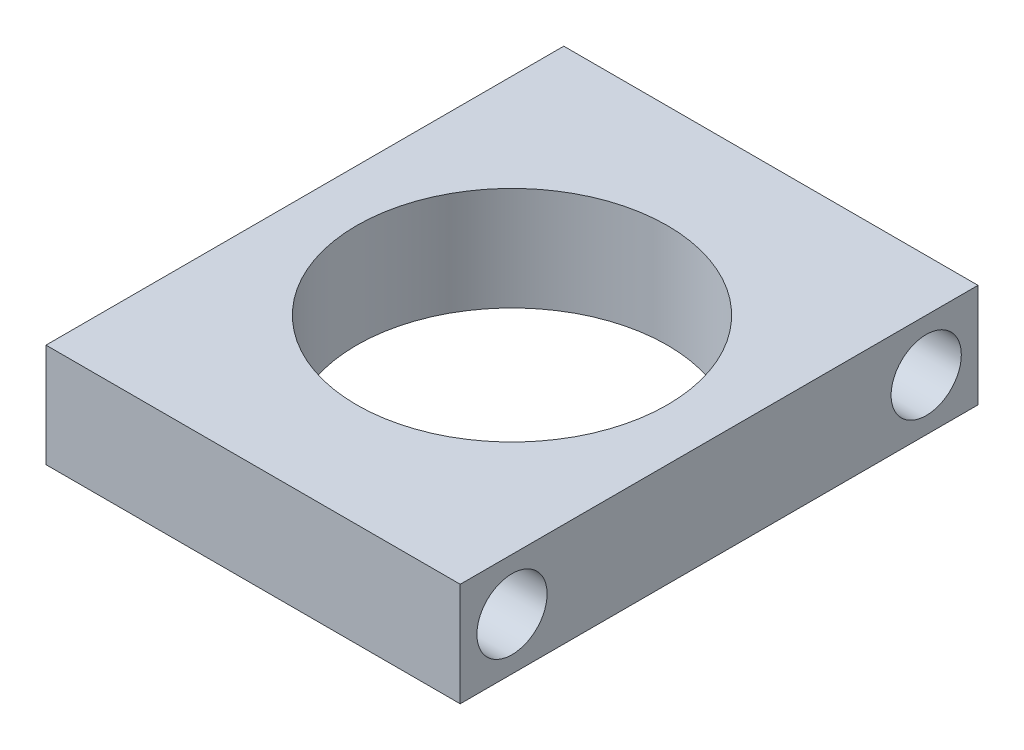
ISO-10303-21;
HEADER;
FILE_DESCRIPTION(('STEP AP214'),'2;1');
FILE_NAME('part.step','',(''),(''),'','','');
FILE_SCHEMA(('AUTOMOTIVE_DESIGN { 1 0 10303 214 1 1 1 1 }'));
ENDSEC;
DATA;
#1=APPLICATION_CONTEXT('core data for automotive mechanical design processes');
#2=APPLICATION_PROTOCOL_DEFINITION('international standard','automotive_design',2000,#1);
#3=PRODUCT_CONTEXT('',#1,'mechanical');
#4=PRODUCT('Part','Part','',(#3));
#5=PRODUCT_RELATED_PRODUCT_CATEGORY('part','',(#4));
#6=PRODUCT_DEFINITION_FORMATION('','',#4);
#7=PRODUCT_DEFINITION_CONTEXT('part definition',#1,'design');
#8=PRODUCT_DEFINITION('design','',#6,#7);
#9=PRODUCT_DEFINITION_SHAPE('','',#8);
#10=(LENGTH_UNIT() NAMED_UNIT(*) SI_UNIT(.MILLI.,.METRE.));
#11=(NAMED_UNIT(*) PLANE_ANGLE_UNIT() SI_UNIT($,.RADIAN.));
#12=(NAMED_UNIT(*) SI_UNIT($,.STERADIAN.) SOLID_ANGLE_UNIT());
#13=UNCERTAINTY_MEASURE_WITH_UNIT(LENGTH_MEASURE(1.E-05),#10,'distance_accuracy_value','');
#14=(GEOMETRIC_REPRESENTATION_CONTEXT(3) GLOBAL_UNCERTAINTY_ASSIGNED_CONTEXT((#13)) GLOBAL_UNIT_ASSIGNED_CONTEXT((#10,
#11,#12)) REPRESENTATION_CONTEXT('',''));
#15=CARTESIAN_POINT('',(0.,0.,0.));
#16=DIRECTION('',(0.,0.,1.));
#17=DIRECTION('',(1.,0.,0.));
#18=AXIS2_PLACEMENT_3D('',#15,#16,#17);
#19=CARTESIAN_POINT('',(-25.4,-3.175,-15.875));
#20=DIRECTION('',(-1.,0.,0.));
#21=DIRECTION('',(0.,0.,1.));
#22=AXIS2_PLACEMENT_3D('',#19,#20,#21);
#23=PLANE('',#22);
#24=CARTESIAN_POINT('',(-25.4,0.,-12.7));
#25=DIRECTION('',(1.,0.,0.));
#26=DIRECTION('',(0.,0.,-1.));
#27=AXIS2_PLACEMENT_3D('',#24,#25,#26);
#28=CIRCLE('',#27,2.15265);
#29=CARTESIAN_POINT('',(-25.4,0.,-14.85265));
#30=VERTEX_POINT('',#29);
#31=EDGE_CURVE('E155',#30,#30,#28,.T.);
#32=ORIENTED_EDGE('',*,*,#31,.T.);
#33=EDGE_LOOP('',(#32));
#34=FACE_BOUND('',#33,.T.);
#35=CARTESIAN_POINT('',(-25.4,0.,12.7));
#36=DIRECTION('',(1.,0.,0.));
#37=DIRECTION('',(0.,0.,-1.));
#38=AXIS2_PLACEMENT_3D('',#35,#36,#37);
#39=CIRCLE('',#38,2.15265);
#40=CARTESIAN_POINT('',(-25.4,0.,10.54735));
#41=VERTEX_POINT('',#40);
#42=EDGE_CURVE('E102',#41,#41,#39,.T.);
#43=ORIENTED_EDGE('',*,*,#42,.T.);
#44=EDGE_LOOP('',(#43));
#45=FACE_BOUND('',#44,.T.);
#46=DIRECTION('',(0.,0.,1.));
#47=VECTOR('',#46,1.);
#48=CARTESIAN_POINT('',(-25.4,3.175,-15.875));
#49=LINE('',#48,#47);
#50=CARTESIAN_POINT('',(-25.4,3.175,-15.875));
#51=VERTEX_POINT('',#50);
#52=CARTESIAN_POINT('',(-25.4,3.175,15.875));
#53=VERTEX_POINT('',#52);
#54=EDGE_CURVE('E98',#51,#53,#49,.T.);
#55=ORIENTED_EDGE('',*,*,#54,.F.);
#56=DIRECTION('',(0.,1.,0.));
#57=VECTOR('',#56,1.);
#58=CARTESIAN_POINT('',(-25.4,-3.175,-15.875));
#59=LINE('',#58,#57);
#60=CARTESIAN_POINT('',(-25.4,-3.175,-15.875));
#61=VERTEX_POINT('',#60);
#62=EDGE_CURVE('E11',#61,#51,#59,.T.);
#63=ORIENTED_EDGE('',*,*,#62,.F.);
#64=DIRECTION('',(0.,0.,1.));
#65=VECTOR('',#64,1.);
#66=CARTESIAN_POINT('',(-25.4,-3.175,-15.875));
#67=LINE('',#66,#65);
#68=CARTESIAN_POINT('',(-25.4,-3.175,15.875));
#69=VERTEX_POINT('',#68);
#70=EDGE_CURVE('E91',#61,#69,#67,.T.);
#71=ORIENTED_EDGE('',*,*,#70,.T.);
#72=DIRECTION('',(0.,1.,0.));
#73=VECTOR('',#72,1.);
#74=CARTESIAN_POINT('',(-25.4,-3.175,15.875));
#75=LINE('',#74,#73);
#76=EDGE_CURVE('E36',#69,#53,#75,.T.);
#77=ORIENTED_EDGE('',*,*,#76,.T.);
#78=EDGE_LOOP('',(#55,#63,#71,#77));
#79=FACE_BOUND('',#78,.T.);
#80=ADVANCED_FACE('F33',(#34,#45,#79),#23,.T.);
#81=CARTESIAN_POINT('',(-25.4,-3.175,-15.875));
#82=DIRECTION('',(0.,0.,-1.));
#83=DIRECTION('',(-1.,0.,0.));
#84=AXIS2_PLACEMENT_3D('',#81,#82,#83);
#85=PLANE('',#84);
#86=DIRECTION('',(-1.,0.,0.));
#87=VECTOR('',#86,1.);
#88=CARTESIAN_POINT('',(-25.4,3.175,-15.875));
#89=LINE('',#88,#87);
#90=CARTESIAN_POINT('',(0.,3.175,-15.875));
#91=VERTEX_POINT('',#90);
#92=EDGE_CURVE('E93',#91,#51,#89,.T.);
#93=ORIENTED_EDGE('',*,*,#92,.F.);
#94=DIRECTION('',(0.,1.,0.));
#95=VECTOR('',#94,1.);
#96=CARTESIAN_POINT('',(0.,-3.175,-15.875));
#97=LINE('',#96,#95);
#98=CARTESIAN_POINT('',(0.,-3.175,-15.875));
#99=VERTEX_POINT('',#98);
#100=EDGE_CURVE('E42',#99,#91,#97,.T.);
#101=ORIENTED_EDGE('',*,*,#100,.F.);
#102=DIRECTION('',(-1.,0.,0.));
#103=VECTOR('',#102,1.);
#104=CARTESIAN_POINT('',(-25.4,-3.175,-15.875));
#105=LINE('',#104,#103);
#106=EDGE_CURVE('E88',#99,#61,#105,.T.);
#107=ORIENTED_EDGE('',*,*,#106,.T.);
#108=ORIENTED_EDGE('',*,*,#62,.T.);
#109=EDGE_LOOP('',(#93,#101,#107,#108));
#110=FACE_BOUND('',#109,.T.);
#111=ADVANCED_FACE('F109',(#110),#85,.T.);
#112=CARTESIAN_POINT('',(0.,-3.175,-15.875));
#113=DIRECTION('',(1.,0.,0.));
#114=DIRECTION('',(0.,0.,-1.));
#115=AXIS2_PLACEMENT_3D('',#112,#113,#114);
#116=PLANE('',#115);
#117=CARTESIAN_POINT('',(0.,0.,-12.7));
#118=DIRECTION('',(1.,0.,0.));
#119=DIRECTION('',(0.,0.,-1.));
#120=AXIS2_PLACEMENT_3D('',#117,#118,#119);
#121=CIRCLE('',#120,2.15265);
#122=CARTESIAN_POINT('',(0.,0.,-14.85265));
#123=VERTEX_POINT('',#122);
#124=EDGE_CURVE('E152',#123,#123,#121,.T.);
#125=ORIENTED_EDGE('',*,*,#124,.F.);
#126=EDGE_LOOP('',(#125));
#127=FACE_BOUND('',#126,.T.);
#128=CARTESIAN_POINT('',(0.,0.,12.7));
#129=DIRECTION('',(1.,0.,0.));
#130=DIRECTION('',(0.,0.,-1.));
#131=AXIS2_PLACEMENT_3D('',#128,#129,#130);
#132=CIRCLE('',#131,2.15265);
#133=CARTESIAN_POINT('',(0.,0.,10.54735));
#134=VERTEX_POINT('',#133);
#135=EDGE_CURVE('E158',#134,#134,#132,.T.);
#136=ORIENTED_EDGE('',*,*,#135,.F.);
#137=EDGE_LOOP('',(#136));
#138=FACE_BOUND('',#137,.T.);
#139=DIRECTION('',(0.,0.,-1.));
#140=VECTOR('',#139,1.);
#141=CARTESIAN_POINT('',(0.,3.175,-15.875));
#142=LINE('',#141,#140);
#143=CARTESIAN_POINT('',(0.,3.175,15.875));
#144=VERTEX_POINT('',#143);
#145=EDGE_CURVE('E83',#144,#91,#142,.T.);
#146=ORIENTED_EDGE('',*,*,#145,.F.);
#147=DIRECTION('',(0.,1.,0.));
#148=VECTOR('',#147,1.);
#149=CARTESIAN_POINT('',(0.,-3.175,15.875));
#150=LINE('',#149,#148);
#151=CARTESIAN_POINT('',(0.,-3.175,15.875));
#152=VERTEX_POINT('',#151);
#153=EDGE_CURVE('E78',#152,#144,#150,.T.);
#154=ORIENTED_EDGE('',*,*,#153,.F.);
#155=DIRECTION('',(0.,0.,-1.));
#156=VECTOR('',#155,1.);
#157=CARTESIAN_POINT('',(0.,-3.175,-15.875));
#158=LINE('',#157,#156);
#159=EDGE_CURVE('E81',#152,#99,#158,.T.);
#160=ORIENTED_EDGE('',*,*,#159,.T.);
#161=ORIENTED_EDGE('',*,*,#100,.T.);
#162=EDGE_LOOP('',(#146,#154,#160,#161));
#163=FACE_BOUND('',#162,.T.);
#164=ADVANCED_FACE('F80',(#127,#138,#163),#116,.T.);
#165=CARTESIAN_POINT('',(-25.4,-3.175,15.875));
#166=DIRECTION('',(0.,0.,1.));
#167=DIRECTION('',(1.,0.,0.));
#168=AXIS2_PLACEMENT_3D('',#165,#166,#167);
#169=PLANE('',#168);
#170=DIRECTION('',(1.,0.,0.));
#171=VECTOR('',#170,1.);
#172=CARTESIAN_POINT('',(-25.4,3.175,15.875));
#173=LINE('',#172,#171);
#174=EDGE_CURVE('E101',#53,#144,#173,.T.);
#175=ORIENTED_EDGE('',*,*,#174,.F.);
#176=ORIENTED_EDGE('',*,*,#76,.F.);
#177=DIRECTION('',(1.,0.,0.));
#178=VECTOR('',#177,1.);
#179=CARTESIAN_POINT('',(-25.4,-3.175,15.875));
#180=LINE('',#179,#178);
#181=EDGE_CURVE('E87',#69,#152,#180,.T.);
#182=ORIENTED_EDGE('',*,*,#181,.T.);
#183=ORIENTED_EDGE('',*,*,#153,.T.);
#184=EDGE_LOOP('',(#175,#176,#182,#183));
#185=FACE_BOUND('',#184,.T.);
#186=ADVANCED_FACE('F90',(#185),#169,.T.);
#187=CARTESIAN_POINT('',(0.,-3.175,0.));
#188=DIRECTION('',(0.,1.,0.));
#189=DIRECTION('',(0.,0.,1.));
#190=AXIS2_PLACEMENT_3D('',#187,#188,#189);
#191=PLANE('',#190);
#192=CARTESIAN_POINT('',(-12.7,-3.175,0.));
#193=DIRECTION('',(0.,1.,0.));
#194=DIRECTION('',(0.,0.,1.));
#195=AXIS2_PLACEMENT_3D('',#192,#193,#194);
#196=CIRCLE('',#195,9.525);
#197=CARTESIAN_POINT('',(-12.7,-3.175,9.525));
#198=VERTEX_POINT('',#197);
#199=EDGE_CURVE('E147',#198,#198,#196,.T.);
#200=ORIENTED_EDGE('',*,*,#199,.T.);
#201=EDGE_LOOP('',(#200));
#202=FACE_BOUND('',#201,.T.);
#203=ORIENTED_EDGE('',*,*,#70,.F.);
#204=ORIENTED_EDGE('',*,*,#106,.F.);
#205=ORIENTED_EDGE('',*,*,#159,.F.);
#206=ORIENTED_EDGE('',*,*,#181,.F.);
#207=EDGE_LOOP('',(#203,#204,#205,#206));
#208=FACE_BOUND('',#207,.T.);
#209=ADVANCED_FACE('F86',(#202,#208),#191,.F.);
#210=CARTESIAN_POINT('',(0.,3.175,0.));
#211=DIRECTION('',(0.,1.,0.));
#212=DIRECTION('',(0.,0.,1.));
#213=AXIS2_PLACEMENT_3D('',#210,#211,#212);
#214=PLANE('',#213);
#215=CARTESIAN_POINT('',(-12.7,3.175,0.));
#216=DIRECTION('',(0.,1.,0.));
#217=DIRECTION('',(0.,0.,1.));
#218=AXIS2_PLACEMENT_3D('',#215,#216,#217);
#219=CIRCLE('',#218,9.525);
#220=CARTESIAN_POINT('',(-12.7,3.175,9.525));
#221=VERTEX_POINT('',#220);
#222=EDGE_CURVE('E150',#221,#221,#219,.T.);
#223=ORIENTED_EDGE('',*,*,#222,.F.);
#224=EDGE_LOOP('',(#223));
#225=FACE_BOUND('',#224,.T.);
#226=ORIENTED_EDGE('',*,*,#54,.T.);
#227=ORIENTED_EDGE('',*,*,#174,.T.);
#228=ORIENTED_EDGE('',*,*,#145,.T.);
#229=ORIENTED_EDGE('',*,*,#92,.T.);
#230=EDGE_LOOP('',(#226,#227,#228,#229));
#231=FACE_BOUND('',#230,.T.);
#232=ADVANCED_FACE('F108',(#225,#231),#214,.T.);
#233=CARTESIAN_POINT('',(-25.4,0.,12.7));
#234=DIRECTION('',(1.,0.,0.));
#235=DIRECTION('',(0.,0.,-1.));
#236=AXIS2_PLACEMENT_3D('',#233,#234,#235);
#237=CYLINDRICAL_SURFACE('',#236,2.15265);
#238=ORIENTED_EDGE('',*,*,#42,.F.);
#239=EDGE_LOOP('',(#238));
#240=FACE_BOUND('',#239,.T.);
#241=ORIENTED_EDGE('',*,*,#135,.T.);
#242=EDGE_LOOP('',(#241));
#243=FACE_BOUND('',#242,.T.);
#244=ADVANCED_FACE('F129',(#240,#243),#237,.F.);
#245=CARTESIAN_POINT('',(-25.4,0.,-12.7));
#246=DIRECTION('',(1.,0.,0.));
#247=DIRECTION('',(0.,0.,-1.));
#248=AXIS2_PLACEMENT_3D('',#245,#246,#247);
#249=CYLINDRICAL_SURFACE('',#248,2.15265);
#250=ORIENTED_EDGE('',*,*,#31,.F.);
#251=EDGE_LOOP('',(#250));
#252=FACE_BOUND('',#251,.T.);
#253=ORIENTED_EDGE('',*,*,#124,.T.);
#254=EDGE_LOOP('',(#253));
#255=FACE_BOUND('',#254,.T.);
#256=ADVANCED_FACE('F135',(#252,#255),#249,.F.);
#257=CARTESIAN_POINT('',(-12.7,-3.175,0.));
#258=DIRECTION('',(0.,1.,0.));
#259=DIRECTION('',(0.,0.,1.));
#260=AXIS2_PLACEMENT_3D('',#257,#258,#259);
#261=CYLINDRICAL_SURFACE('',#260,9.525);
#262=ORIENTED_EDGE('',*,*,#199,.F.);
#263=EDGE_LOOP('',(#262));
#264=FACE_BOUND('',#263,.T.);
#265=ORIENTED_EDGE('',*,*,#222,.T.);
#266=EDGE_LOOP('',(#265));
#267=FACE_BOUND('',#266,.T.);
#268=ADVANCED_FACE('F139',(#264,#267),#261,.F.);
#269=CLOSED_SHELL('',(#80,#111,#164,#186,#209,#232,#244,#256,#268));
#270=MANIFOLD_SOLID_BREP('B2',#269);
#271=ADVANCED_BREP_SHAPE_REPRESENTATION('',(#18,#270),#14);
#272=SHAPE_DEFINITION_REPRESENTATION(#9,#271);
ENDSEC;
END-ISO-10303-21;
